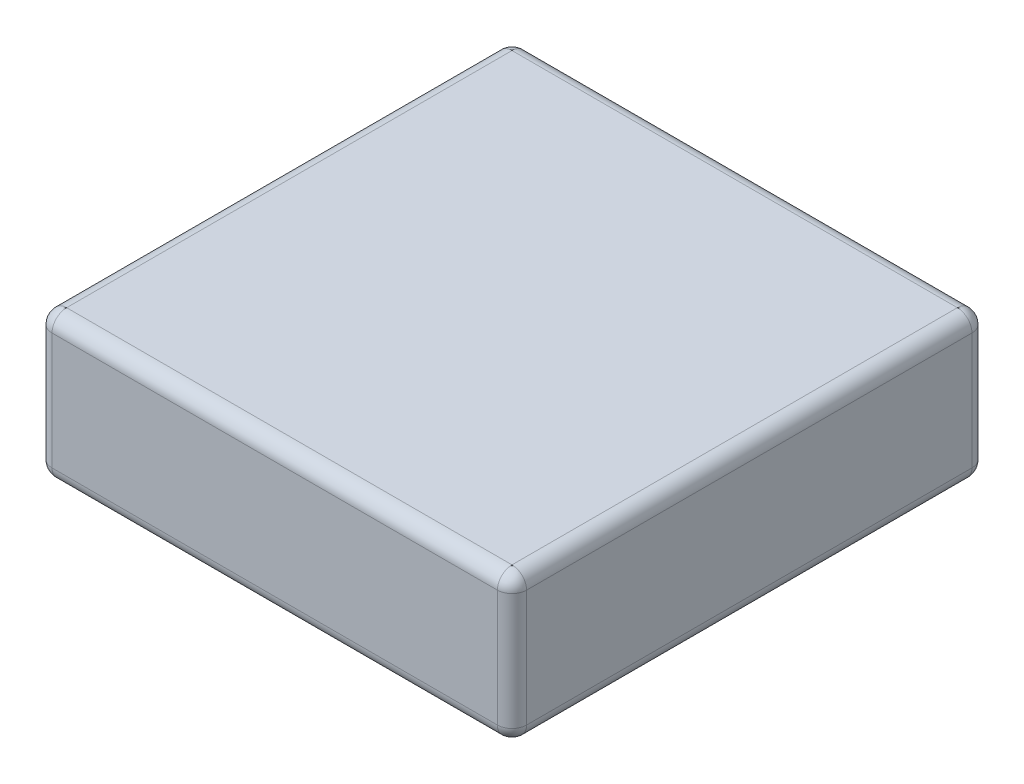
ISO-10303-21;
HEADER;
FILE_DESCRIPTION(('STEP AP214'),'2;1');
FILE_NAME('part.step','',(''),(''),'','','');
FILE_SCHEMA(('AUTOMOTIVE_DESIGN { 1 0 10303 214 1 1 1 1 }'));
ENDSEC;
DATA;
#1=APPLICATION_CONTEXT('core data for automotive mechanical design processes');
#2=APPLICATION_PROTOCOL_DEFINITION('international standard','automotive_design',2000,#1);
#3=PRODUCT_CONTEXT('',#1,'mechanical');
#4=PRODUCT('Part','Part','',(#3));
#5=PRODUCT_RELATED_PRODUCT_CATEGORY('part','',(#4));
#6=PRODUCT_DEFINITION_FORMATION('','',#4);
#7=PRODUCT_DEFINITION_CONTEXT('part definition',#1,'design');
#8=PRODUCT_DEFINITION('design','',#6,#7);
#9=PRODUCT_DEFINITION_SHAPE('','',#8);
#10=(LENGTH_UNIT() NAMED_UNIT(*) SI_UNIT(.MILLI.,.METRE.));
#11=(NAMED_UNIT(*) PLANE_ANGLE_UNIT() SI_UNIT($,.RADIAN.));
#12=(NAMED_UNIT(*) SI_UNIT($,.STERADIAN.) SOLID_ANGLE_UNIT());
#13=UNCERTAINTY_MEASURE_WITH_UNIT(LENGTH_MEASURE(1.E-05),#10,'distance_accuracy_value','');
#14=(GEOMETRIC_REPRESENTATION_CONTEXT(3) GLOBAL_UNCERTAINTY_ASSIGNED_CONTEXT((#13)) GLOBAL_UNIT_ASSIGNED_CONTEXT((#10,
#11,#12)) REPRESENTATION_CONTEXT('',''));
#15=CARTESIAN_POINT('',(0.,0.,0.));
#16=DIRECTION('',(0.,0.,1.));
#17=DIRECTION('',(1.,0.,0.));
#18=AXIS2_PLACEMENT_3D('',#15,#16,#17);
#19=CARTESIAN_POINT('',(5.82905,3.1756,-3.993025));
#20=DIRECTION('',(1.,0.,0.));
#21=DIRECTION('',(0.,0.,-1.));
#22=AXIS2_PLACEMENT_3D('',#19,#20,#21);
#23=PLANE('',#22);
#24=DIRECTION('',(0.,1.,0.));
#25=VECTOR('',#24,1.);
#26=CARTESIAN_POINT('',(5.82905,3.1756,-4.013025));
#27=LINE('',#26,#25);
#28=CARTESIAN_POINT('',(5.82905,2.9956,-4.013025));
#29=VERTEX_POINT('',#28);
#30=CARTESIAN_POINT('',(5.82905,3.1556,-4.013025));
#31=VERTEX_POINT('',#30);
#32=EDGE_CURVE('E11',#29,#31,#27,.T.);
#33=ORIENTED_EDGE('',*,*,#32,.T.);
#34=DIRECTION('',(0.,0.,-1.));
#35=VECTOR('',#34,1.);
#36=CARTESIAN_POINT('',(5.82905,3.1556,-3.993025));
#37=LINE('',#36,#35);
#38=CARTESIAN_POINT('',(5.82905,3.1556,-4.623025));
#39=VERTEX_POINT('',#38);
#40=EDGE_CURVE('E24',#31,#39,#37,.T.);
#41=ORIENTED_EDGE('',*,*,#40,.T.);
#42=DIRECTION('',(0.,-1.,0.));
#43=VECTOR('',#42,1.);
#44=CARTESIAN_POINT('',(5.82905,3.1756,-4.623025));
#45=LINE('',#44,#43);
#46=CARTESIAN_POINT('',(5.82905,2.9956,-4.623025));
#47=VERTEX_POINT('',#46);
#48=EDGE_CURVE('E215',#39,#47,#45,.T.);
#49=ORIENTED_EDGE('',*,*,#48,.T.);
#50=DIRECTION('',(0.,0.,1.));
#51=VECTOR('',#50,1.);
#52=CARTESIAN_POINT('',(5.82905,2.9956,-3.993025));
#53=LINE('',#52,#51);
#54=EDGE_CURVE('E213',#47,#29,#53,.T.);
#55=ORIENTED_EDGE('',*,*,#54,.T.);
#56=EDGE_LOOP('',(#33,#41,#49,#55));
#57=FACE_BOUND('',#56,.T.);
#58=ADVANCED_FACE('F17',(#57),#23,.F.);
#59=CARTESIAN_POINT('',(5.82905,3.1756,-3.993025));
#60=DIRECTION('',(0.,0.,-1.));
#61=DIRECTION('',(-1.,0.,0.));
#62=AXIS2_PLACEMENT_3D('',#59,#60,#61);
#63=PLANE('',#62);
#64=DIRECTION('',(-1.,0.,0.));
#65=VECTOR('',#64,1.);
#66=CARTESIAN_POINT('',(5.82905,3.1556,-3.993025));
#67=LINE('',#66,#65);
#68=CARTESIAN_POINT('',(6.45905,3.1556,-3.993025));
#69=VERTEX_POINT('',#68);
#70=CARTESIAN_POINT('',(5.84905,3.1556,-3.993025));
#71=VERTEX_POINT('',#70);
#72=EDGE_CURVE('E211',#69,#71,#67,.T.);
#73=ORIENTED_EDGE('',*,*,#72,.T.);
#74=DIRECTION('',(0.,-1.,0.));
#75=VECTOR('',#74,1.);
#76=CARTESIAN_POINT('',(5.84905,3.1756,-3.993025));
#77=LINE('',#76,#75);
#78=CARTESIAN_POINT('',(5.84905,2.9956,-3.993025));
#79=VERTEX_POINT('',#78);
#80=EDGE_CURVE('E209',#71,#79,#77,.T.);
#81=ORIENTED_EDGE('',*,*,#80,.T.);
#82=DIRECTION('',(1.,0.,0.));
#83=VECTOR('',#82,1.);
#84=CARTESIAN_POINT('',(6.47905,2.9956,-3.993025));
#85=LINE('',#84,#83);
#86=CARTESIAN_POINT('',(6.45905,2.9956,-3.993025));
#87=VERTEX_POINT('',#86);
#88=EDGE_CURVE('E135',#79,#87,#85,.T.);
#89=ORIENTED_EDGE('',*,*,#88,.T.);
#90=DIRECTION('',(0.,1.,0.));
#91=VECTOR('',#90,1.);
#92=CARTESIAN_POINT('',(6.45905,3.1756,-3.993025));
#93=LINE('',#92,#91);
#94=EDGE_CURVE('E205',#87,#69,#93,.T.);
#95=ORIENTED_EDGE('',*,*,#94,.T.);
#96=EDGE_LOOP('',(#73,#81,#89,#95));
#97=FACE_BOUND('',#96,.T.);
#98=ADVANCED_FACE('F297',(#97),#63,.F.);
#99=CARTESIAN_POINT('',(6.47905,3.1756,-3.993025));
#100=DIRECTION('',(-1.,0.,0.));
#101=DIRECTION('',(0.,0.,1.));
#102=AXIS2_PLACEMENT_3D('',#99,#100,#101);
#103=PLANE('',#102);
#104=DIRECTION('',(0.,0.,-1.));
#105=VECTOR('',#104,1.);
#106=CARTESIAN_POINT('',(6.47905,2.9956,-4.643025));
#107=LINE('',#106,#105);
#108=CARTESIAN_POINT('',(6.47905,2.9956,-4.013025));
#109=VERTEX_POINT('',#108);
#110=CARTESIAN_POINT('',(6.47905,2.9956,-4.623025));
#111=VERTEX_POINT('',#110);
#112=EDGE_CURVE('E203',#109,#111,#107,.T.);
#113=ORIENTED_EDGE('',*,*,#112,.T.);
#114=DIRECTION('',(0.,1.,0.));
#115=VECTOR('',#114,1.);
#116=CARTESIAN_POINT('',(6.47905,3.1756,-4.623025));
#117=LINE('',#116,#115);
#118=CARTESIAN_POINT('',(6.47905,3.1556,-4.623025));
#119=VERTEX_POINT('',#118);
#120=EDGE_CURVE('E201',#111,#119,#117,.T.);
#121=ORIENTED_EDGE('',*,*,#120,.T.);
#122=DIRECTION('',(0.,0.,1.));
#123=VECTOR('',#122,1.);
#124=CARTESIAN_POINT('',(6.47905,3.1556,-3.993025));
#125=LINE('',#124,#123);
#126=CARTESIAN_POINT('',(6.47905,3.1556,-4.013025));
#127=VERTEX_POINT('',#126);
#128=EDGE_CURVE('E199',#119,#127,#125,.T.);
#129=ORIENTED_EDGE('',*,*,#128,.T.);
#130=DIRECTION('',(0.,-1.,0.));
#131=VECTOR('',#130,1.);
#132=CARTESIAN_POINT('',(6.47905,3.1756,-4.013025));
#133=LINE('',#132,#131);
#134=EDGE_CURVE('E196',#127,#109,#133,.T.);
#135=ORIENTED_EDGE('',*,*,#134,.T.);
#136=EDGE_LOOP('',(#113,#121,#129,#135));
#137=FACE_BOUND('',#136,.T.);
#138=ADVANCED_FACE('F277',(#137),#103,.F.);
#139=CARTESIAN_POINT('',(5.82905,3.1756,-4.643025));
#140=DIRECTION('',(0.,0.,1.));
#141=DIRECTION('',(1.,0.,0.));
#142=AXIS2_PLACEMENT_3D('',#139,#140,#141);
#143=PLANE('',#142);
#144=DIRECTION('',(1.,0.,0.));
#145=VECTOR('',#144,1.);
#146=CARTESIAN_POINT('',(5.82905,3.1556,-4.643025));
#147=LINE('',#146,#145);
#148=CARTESIAN_POINT('',(5.84905,3.1556,-4.643025));
#149=VERTEX_POINT('',#148);
#150=CARTESIAN_POINT('',(6.45905,3.1556,-4.643025));
#151=VERTEX_POINT('',#150);
#152=EDGE_CURVE('E194',#149,#151,#147,.T.);
#153=ORIENTED_EDGE('',*,*,#152,.T.);
#154=DIRECTION('',(0.,-1.,0.));
#155=VECTOR('',#154,1.);
#156=CARTESIAN_POINT('',(6.45905,3.1756,-4.643025));
#157=LINE('',#156,#155);
#158=CARTESIAN_POINT('',(6.45905,2.9956,-4.643025));
#159=VERTEX_POINT('',#158);
#160=EDGE_CURVE('E192',#151,#159,#157,.T.);
#161=ORIENTED_EDGE('',*,*,#160,.T.);
#162=DIRECTION('',(-1.,0.,0.));
#163=VECTOR('',#162,1.);
#164=CARTESIAN_POINT('',(5.82905,2.9956,-4.643025));
#165=LINE('',#164,#163);
#166=CARTESIAN_POINT('',(5.84905,2.9956,-4.643025));
#167=VERTEX_POINT('',#166);
#168=EDGE_CURVE('E190',#159,#167,#165,.T.);
#169=ORIENTED_EDGE('',*,*,#168,.T.);
#170=DIRECTION('',(0.,1.,0.));
#171=VECTOR('',#170,1.);
#172=CARTESIAN_POINT('',(5.84905,3.1756,-4.643025));
#173=LINE('',#172,#171);
#174=EDGE_CURVE('E187',#167,#149,#173,.T.);
#175=ORIENTED_EDGE('',*,*,#174,.T.);
#176=EDGE_LOOP('',(#153,#161,#169,#175));
#177=FACE_BOUND('',#176,.T.);
#178=ADVANCED_FACE('F238',(#177),#143,.F.);
#179=CARTESIAN_POINT('',(5.22905,3.1756,-4.318025));
#180=DIRECTION('',(0.,-1.,0.));
#181=DIRECTION('',(0.,0.,-1.));
#182=AXIS2_PLACEMENT_3D('',#179,#180,#181);
#183=PLANE('',#182);
#184=DIRECTION('',(0.,0.,-1.));
#185=VECTOR('',#184,1.);
#186=CARTESIAN_POINT('',(6.45905,3.1756,-4.318025));
#187=LINE('',#186,#185);
#188=CARTESIAN_POINT('',(6.45905,3.1756,-4.013025));
#189=VERTEX_POINT('',#188);
#190=CARTESIAN_POINT('',(6.45905,3.1756,-4.623025));
#191=VERTEX_POINT('',#190);
#192=EDGE_CURVE('E185',#189,#191,#187,.T.);
#193=ORIENTED_EDGE('',*,*,#192,.T.);
#194=DIRECTION('',(-1.,0.,0.));
#195=VECTOR('',#194,1.);
#196=CARTESIAN_POINT('',(5.22905,3.1756,-4.623025));
#197=LINE('',#196,#195);
#198=CARTESIAN_POINT('',(5.84905,3.1756,-4.623025));
#199=VERTEX_POINT('',#198);
#200=EDGE_CURVE('E183',#191,#199,#197,.T.);
#201=ORIENTED_EDGE('',*,*,#200,.T.);
#202=DIRECTION('',(0.,0.,1.));
#203=VECTOR('',#202,1.);
#204=CARTESIAN_POINT('',(5.84905,3.1756,-4.318025));
#205=LINE('',#204,#203);
#206=CARTESIAN_POINT('',(5.84905,3.1756,-4.013025));
#207=VERTEX_POINT('',#206);
#208=EDGE_CURVE('E181',#199,#207,#205,.T.);
#209=ORIENTED_EDGE('',*,*,#208,.T.);
#210=DIRECTION('',(1.,0.,0.));
#211=VECTOR('',#210,1.);
#212=CARTESIAN_POINT('',(5.22905,3.1756,-4.013025));
#213=LINE('',#212,#211);
#214=EDGE_CURVE('E178',#207,#189,#213,.T.);
#215=ORIENTED_EDGE('',*,*,#214,.T.);
#216=EDGE_LOOP('',(#193,#201,#209,#215));
#217=FACE_BOUND('',#216,.T.);
#218=ADVANCED_FACE('F309',(#217),#183,.F.);
#219=CARTESIAN_POINT('',(5.22905,2.9756,-4.318025));
#220=DIRECTION('',(0.,-1.,0.));
#221=DIRECTION('',(0.,0.,-1.));
#222=AXIS2_PLACEMENT_3D('',#219,#220,#221);
#223=PLANE('',#222);
#224=DIRECTION('',(1.,0.,0.));
#225=VECTOR('',#224,1.);
#226=CARTESIAN_POINT('',(6.47905,2.9756,-4.623025));
#227=LINE('',#226,#225);
#228=CARTESIAN_POINT('',(5.84905,2.9756,-4.623025));
#229=VERTEX_POINT('',#228);
#230=CARTESIAN_POINT('',(6.45905,2.9756,-4.623025));
#231=VERTEX_POINT('',#230);
#232=EDGE_CURVE('E176',#229,#231,#227,.T.);
#233=ORIENTED_EDGE('',*,*,#232,.T.);
#234=DIRECTION('',(0.,0.,1.));
#235=VECTOR('',#234,1.);
#236=CARTESIAN_POINT('',(6.45905,2.9756,-3.993025));
#237=LINE('',#236,#235);
#238=CARTESIAN_POINT('',(6.45905,2.9756,-4.013025));
#239=VERTEX_POINT('',#238);
#240=EDGE_CURVE('E108',#231,#239,#237,.T.);
#241=ORIENTED_EDGE('',*,*,#240,.T.);
#242=DIRECTION('',(-1.,0.,0.));
#243=VECTOR('',#242,1.);
#244=CARTESIAN_POINT('',(5.82905,2.9756,-4.013025));
#245=LINE('',#244,#243);
#246=CARTESIAN_POINT('',(5.84905,2.9756,-4.013025));
#247=VERTEX_POINT('',#246);
#248=EDGE_CURVE('E102',#239,#247,#245,.T.);
#249=ORIENTED_EDGE('',*,*,#248,.T.);
#250=DIRECTION('',(0.,0.,-1.));
#251=VECTOR('',#250,1.);
#252=CARTESIAN_POINT('',(5.84905,2.9756,-4.643025));
#253=LINE('',#252,#251);
#254=EDGE_CURVE('E105',#247,#229,#253,.T.);
#255=ORIENTED_EDGE('',*,*,#254,.T.);
#256=EDGE_LOOP('',(#233,#241,#249,#255));
#257=FACE_BOUND('',#256,.T.);
#258=ADVANCED_FACE('F104',(#257),#223,.T.);
#259=CARTESIAN_POINT('',(5.84905,3.1556,-4.318025));
#260=DIRECTION('',(0.,0.,1.));
#261=DIRECTION('',(1.,0.,0.));
#262=AXIS2_PLACEMENT_3D('',#259,#260,#261);
#263=CYLINDRICAL_SURFACE('',#262,0.0200000000000001);
#264=CARTESIAN_POINT('',(5.84905,3.1556,-4.013025));
#265=DIRECTION('',(0.,0.,1.));
#266=DIRECTION('',(1.,0.,0.));
#267=AXIS2_PLACEMENT_3D('',#264,#265,#266);
#268=CIRCLE('',#267,0.0200000000000001);
#269=EDGE_CURVE('E123',#207,#31,#268,.T.);
#270=ORIENTED_EDGE('',*,*,#269,.F.);
#271=ORIENTED_EDGE('',*,*,#208,.F.);
#272=CARTESIAN_POINT('',(5.84905,3.1556,-4.623025));
#273=DIRECTION('',(0.,0.,-1.));
#274=DIRECTION('',(0.,1.,0.));
#275=AXIS2_PLACEMENT_3D('',#272,#273,#274);
#276=CIRCLE('',#275,0.0200000000000001);
#277=EDGE_CURVE('E170',#39,#199,#276,.T.);
#278=ORIENTED_EDGE('',*,*,#277,.F.);
#279=ORIENTED_EDGE('',*,*,#40,.F.);
#280=EDGE_LOOP('',(#270,#271,#278,#279));
#281=FACE_BOUND('',#280,.T.);
#282=ADVANCED_FACE('F227',(#281),#263,.T.);
#283=CARTESIAN_POINT('',(5.84905,3.1556,-4.013025));
#284=DIRECTION('',(0.,1.,0.));
#285=DIRECTION('',(1.,0.,0.));
#286=AXIS2_PLACEMENT_3D('',#283,#284,#285);
#287=SPHERICAL_SURFACE('',#286,0.02);
#288=CARTESIAN_POINT('',(5.84905,3.1556,-4.013025));
#289=DIRECTION('',(1.,0.,0.));
#290=DIRECTION('',(0.,0.,1.));
#291=AXIS2_PLACEMENT_3D('',#288,#289,#290);
#292=CIRCLE('',#291,0.0200000000000001);
#293=EDGE_CURVE('E167',#207,#71,#292,.T.);
#294=ORIENTED_EDGE('',*,*,#293,.F.);
#295=ORIENTED_EDGE('',*,*,#269,.T.);
#296=CARTESIAN_POINT('',(5.84905,3.1556,-4.013025));
#297=DIRECTION('',(0.,-1.,0.));
#298=DIRECTION('',(0.,0.,1.));
#299=AXIS2_PLACEMENT_3D('',#296,#297,#298);
#300=CIRCLE('',#299,0.0200000000000001);
#301=EDGE_CURVE('E165',#71,#31,#300,.T.);
#302=ORIENTED_EDGE('',*,*,#301,.F.);
#303=EDGE_LOOP('',(#294,#295,#302));
#304=FACE_BOUND('',#303,.T.);
#305=ADVANCED_FACE('F317',(#304),#287,.T.);
#306=CARTESIAN_POINT('',(5.84905,3.1556,-4.623025));
#307=DIRECTION('',(0.,1.,0.));
#308=DIRECTION('',(1.,0.,0.));
#309=AXIS2_PLACEMENT_3D('',#306,#307,#308);
#310=SPHERICAL_SURFACE('',#309,0.02);
#311=CARTESIAN_POINT('',(5.84905,3.1556,-4.623025));
#312=DIRECTION('',(0.,-1.,0.));
#313=DIRECTION('',(0.,0.,1.));
#314=AXIS2_PLACEMENT_3D('',#311,#312,#313);
#315=CIRCLE('',#314,0.0200000000000001);
#316=EDGE_CURVE('E162',#39,#149,#315,.T.);
#317=ORIENTED_EDGE('',*,*,#316,.F.);
#318=ORIENTED_EDGE('',*,*,#277,.T.);
#319=CARTESIAN_POINT('',(5.84905,3.1556,-4.623025));
#320=DIRECTION('',(1.,0.,0.));
#321=DIRECTION('',(0.,0.,1.));
#322=AXIS2_PLACEMENT_3D('',#319,#320,#321);
#323=CIRCLE('',#322,0.0200000000000001);
#324=EDGE_CURVE('E159',#149,#199,#323,.T.);
#325=ORIENTED_EDGE('',*,*,#324,.F.);
#326=EDGE_LOOP('',(#317,#318,#325));
#327=FACE_BOUND('',#326,.T.);
#328=ADVANCED_FACE('F229',(#327),#310,.T.);
#329=CARTESIAN_POINT('',(5.84905,3.1756,-4.013025));
#330=DIRECTION('',(0.,-1.,0.));
#331=DIRECTION('',(0.,0.,-1.));
#332=AXIS2_PLACEMENT_3D('',#329,#330,#331);
#333=CYLINDRICAL_SURFACE('',#332,0.0200000000000001);
#334=ORIENTED_EDGE('',*,*,#301,.T.);
#335=ORIENTED_EDGE('',*,*,#32,.F.);
#336=CARTESIAN_POINT('',(5.84905,2.9956,-4.013025));
#337=DIRECTION('',(0.,-1.,0.));
#338=DIRECTION('',(0.,0.,-1.));
#339=AXIS2_PLACEMENT_3D('',#336,#337,#338);
#340=CIRCLE('',#339,0.0200000000000001);
#341=EDGE_CURVE('E130',#79,#29,#340,.T.);
#342=ORIENTED_EDGE('',*,*,#341,.F.);
#343=ORIENTED_EDGE('',*,*,#80,.F.);
#344=EDGE_LOOP('',(#334,#335,#342,#343));
#345=FACE_BOUND('',#344,.T.);
#346=ADVANCED_FACE('F323',(#345),#333,.T.);
#347=CARTESIAN_POINT('',(5.22905,3.1556,-4.013025));
#348=DIRECTION('',(1.,0.,0.));
#349=DIRECTION('',(0.,0.,-1.));
#350=AXIS2_PLACEMENT_3D('',#347,#348,#349);
#351=CYLINDRICAL_SURFACE('',#350,0.0200000000000001);
#352=ORIENTED_EDGE('',*,*,#293,.T.);
#353=ORIENTED_EDGE('',*,*,#72,.F.);
#354=CARTESIAN_POINT('',(6.45905,3.1556,-4.013025));
#355=DIRECTION('',(1.,0.,0.));
#356=DIRECTION('',(0.,0.,-1.));
#357=AXIS2_PLACEMENT_3D('',#354,#355,#356);
#358=CIRCLE('',#357,0.0200000000000001);
#359=EDGE_CURVE('E155',#189,#69,#358,.T.);
#360=ORIENTED_EDGE('',*,*,#359,.F.);
#361=ORIENTED_EDGE('',*,*,#214,.F.);
#362=EDGE_LOOP('',(#352,#353,#360,#361));
#363=FACE_BOUND('',#362,.T.);
#364=ADVANCED_FACE('F326',(#363),#351,.T.);
#365=CARTESIAN_POINT('',(6.45905,3.1556,-4.318025));
#366=DIRECTION('',(0.,0.,-1.));
#367=DIRECTION('',(-1.,0.,0.));
#368=AXIS2_PLACEMENT_3D('',#365,#366,#367);
#369=CYLINDRICAL_SURFACE('',#368,0.0200000000000001);
#370=CARTESIAN_POINT('',(6.45905,3.1556,-4.623025));
#371=DIRECTION('',(0.,0.,-1.));
#372=DIRECTION('',(-1.,0.,0.));
#373=AXIS2_PLACEMENT_3D('',#370,#371,#372);
#374=CIRCLE('',#373,0.0200000000000001);
#375=EDGE_CURVE('E152',#191,#119,#374,.T.);
#376=ORIENTED_EDGE('',*,*,#375,.F.);
#377=ORIENTED_EDGE('',*,*,#192,.F.);
#378=CARTESIAN_POINT('',(6.45905,3.1556,-4.013025));
#379=DIRECTION('',(0.,0.,1.));
#380=DIRECTION('',(1.,0.,0.));
#381=AXIS2_PLACEMENT_3D('',#378,#379,#380);
#382=CIRCLE('',#381,0.0200000000000001);
#383=EDGE_CURVE('E149',#127,#189,#382,.T.);
#384=ORIENTED_EDGE('',*,*,#383,.F.);
#385=ORIENTED_EDGE('',*,*,#128,.F.);
#386=EDGE_LOOP('',(#376,#377,#384,#385));
#387=FACE_BOUND('',#386,.T.);
#388=ADVANCED_FACE('F281',(#387),#369,.T.);
#389=CARTESIAN_POINT('',(5.22905,3.1556,-4.623025));
#390=DIRECTION('',(-1.,0.,0.));
#391=DIRECTION('',(0.,0.,1.));
#392=AXIS2_PLACEMENT_3D('',#389,#390,#391);
#393=CYLINDRICAL_SURFACE('',#392,0.0200000000000001);
#394=ORIENTED_EDGE('',*,*,#324,.T.);
#395=ORIENTED_EDGE('',*,*,#200,.F.);
#396=CARTESIAN_POINT('',(6.45905,3.1556,-4.623025));
#397=DIRECTION('',(1.,0.,0.));
#398=DIRECTION('',(0.,0.,-1.));
#399=AXIS2_PLACEMENT_3D('',#396,#397,#398);
#400=CIRCLE('',#399,0.0200000000000001);
#401=EDGE_CURVE('E146',#151,#191,#400,.T.);
#402=ORIENTED_EDGE('',*,*,#401,.F.);
#403=ORIENTED_EDGE('',*,*,#152,.F.);
#404=EDGE_LOOP('',(#394,#395,#402,#403));
#405=FACE_BOUND('',#404,.T.);
#406=ADVANCED_FACE('F232',(#405),#393,.T.);
#407=CARTESIAN_POINT('',(5.84905,3.1756,-4.623025));
#408=DIRECTION('',(0.,-1.,0.));
#409=DIRECTION('',(0.,0.,-1.));
#410=AXIS2_PLACEMENT_3D('',#407,#408,#409);
#411=CYLINDRICAL_SURFACE('',#410,0.0200000000000001);
#412=ORIENTED_EDGE('',*,*,#316,.T.);
#413=ORIENTED_EDGE('',*,*,#174,.F.);
#414=CARTESIAN_POINT('',(5.84905,2.9956,-4.623025));
#415=DIRECTION('',(0.,-1.,0.));
#416=DIRECTION('',(0.,0.,-1.));
#417=AXIS2_PLACEMENT_3D('',#414,#415,#416);
#418=CIRCLE('',#417,0.0200000000000001);
#419=EDGE_CURVE('E131',#47,#167,#418,.T.);
#420=ORIENTED_EDGE('',*,*,#419,.F.);
#421=ORIENTED_EDGE('',*,*,#48,.F.);
#422=EDGE_LOOP('',(#412,#413,#420,#421));
#423=FACE_BOUND('',#422,.T.);
#424=ADVANCED_FACE('F222',(#423),#411,.T.);
#425=CARTESIAN_POINT('',(5.84905,2.9956,-3.993025));
#426=DIRECTION('',(0.,0.,-1.));
#427=DIRECTION('',(-1.,0.,0.));
#428=AXIS2_PLACEMENT_3D('',#425,#426,#427);
#429=CYLINDRICAL_SURFACE('',#428,0.0200000000000001);
#430=CARTESIAN_POINT('',(5.84905,2.9956,-4.013025));
#431=DIRECTION('',(0.,0.,1.));
#432=DIRECTION('',(1.,0.,0.));
#433=AXIS2_PLACEMENT_3D('',#430,#431,#432);
#434=CIRCLE('',#433,0.0200000000000001);
#435=EDGE_CURVE('E119',#29,#247,#434,.T.);
#436=ORIENTED_EDGE('',*,*,#435,.F.);
#437=ORIENTED_EDGE('',*,*,#54,.F.);
#438=CARTESIAN_POINT('',(5.84905,2.9956,-4.623025));
#439=DIRECTION('',(0.,0.,-1.));
#440=DIRECTION('',(-1.,0.,0.));
#441=AXIS2_PLACEMENT_3D('',#438,#439,#440);
#442=CIRCLE('',#441,0.0200000000000001);
#443=EDGE_CURVE('E121',#229,#47,#442,.T.);
#444=ORIENTED_EDGE('',*,*,#443,.F.);
#445=ORIENTED_EDGE('',*,*,#254,.F.);
#446=EDGE_LOOP('',(#436,#437,#444,#445));
#447=FACE_BOUND('',#446,.T.);
#448=ADVANCED_FACE('F117',(#447),#429,.T.);
#449=CARTESIAN_POINT('',(5.84905,2.9956,-4.013025));
#450=DIRECTION('',(0.,1.,0.));
#451=DIRECTION('',(1.,0.,0.));
#452=AXIS2_PLACEMENT_3D('',#449,#450,#451);
#453=SPHERICAL_SURFACE('',#452,0.02);
#454=ORIENTED_EDGE('',*,*,#341,.T.);
#455=ORIENTED_EDGE('',*,*,#435,.T.);
#456=CARTESIAN_POINT('',(5.84905,2.9956,-4.013025));
#457=DIRECTION('',(1.,0.,0.));
#458=DIRECTION('',(0.,0.,1.));
#459=AXIS2_PLACEMENT_3D('',#456,#457,#458);
#460=CIRCLE('',#459,0.0200000000000001);
#461=EDGE_CURVE('E129',#79,#247,#460,.T.);
#462=ORIENTED_EDGE('',*,*,#461,.F.);
#463=EDGE_LOOP('',(#454,#455,#462));
#464=FACE_BOUND('',#463,.T.);
#465=ADVANCED_FACE('F128',(#464),#453,.T.);
#466=CARTESIAN_POINT('',(6.45905,3.1556,-4.013025));
#467=DIRECTION('',(0.,1.,0.));
#468=DIRECTION('',(1.,0.,0.));
#469=AXIS2_PLACEMENT_3D('',#466,#467,#468);
#470=SPHERICAL_SURFACE('',#469,0.02);
#471=ORIENTED_EDGE('',*,*,#383,.T.);
#472=ORIENTED_EDGE('',*,*,#359,.T.);
#473=CARTESIAN_POINT('',(6.45905,3.1556,-4.013025));
#474=DIRECTION('',(0.,-1.,0.));
#475=DIRECTION('',(0.,0.,1.));
#476=AXIS2_PLACEMENT_3D('',#473,#474,#475);
#477=CIRCLE('',#476,0.0200000000000001);
#478=EDGE_CURVE('E136',#127,#69,#477,.T.);
#479=ORIENTED_EDGE('',*,*,#478,.F.);
#480=EDGE_LOOP('',(#471,#472,#479));
#481=FACE_BOUND('',#480,.T.);
#482=ADVANCED_FACE('F286',(#481),#470,.T.);
#483=CARTESIAN_POINT('',(6.45905,3.1556,-4.623025));
#484=DIRECTION('',(0.,1.,0.));
#485=DIRECTION('',(1.,0.,0.));
#486=AXIS2_PLACEMENT_3D('',#483,#484,#485);
#487=SPHERICAL_SURFACE('',#486,0.02);
#488=ORIENTED_EDGE('',*,*,#401,.T.);
#489=ORIENTED_EDGE('',*,*,#375,.T.);
#490=CARTESIAN_POINT('',(6.45905,3.1556,-4.623025));
#491=DIRECTION('',(0.,-1.,0.));
#492=DIRECTION('',(0.,0.,1.));
#493=AXIS2_PLACEMENT_3D('',#490,#491,#492);
#494=CIRCLE('',#493,0.0200000000000001);
#495=EDGE_CURVE('E140',#151,#119,#494,.T.);
#496=ORIENTED_EDGE('',*,*,#495,.F.);
#497=EDGE_LOOP('',(#488,#489,#496));
#498=FACE_BOUND('',#497,.T.);
#499=ADVANCED_FACE('F284',(#498),#487,.T.);
#500=CARTESIAN_POINT('',(5.84905,2.9956,-4.623025));
#501=DIRECTION('',(0.,1.,0.));
#502=DIRECTION('',(1.,0.,0.));
#503=AXIS2_PLACEMENT_3D('',#500,#501,#502);
#504=SPHERICAL_SURFACE('',#503,0.02);
#505=ORIENTED_EDGE('',*,*,#443,.T.);
#506=ORIENTED_EDGE('',*,*,#419,.T.);
#507=CARTESIAN_POINT('',(5.84905,2.9956,-4.623025));
#508=DIRECTION('',(1.,0.,0.));
#509=DIRECTION('',(0.,0.,1.));
#510=AXIS2_PLACEMENT_3D('',#507,#508,#509);
#511=CIRCLE('',#510,0.0200000000000001);
#512=EDGE_CURVE('E243',#229,#167,#511,.T.);
#513=ORIENTED_EDGE('',*,*,#512,.F.);
#514=EDGE_LOOP('',(#505,#506,#513));
#515=FACE_BOUND('',#514,.T.);
#516=ADVANCED_FACE('F242',(#515),#504,.T.);
#517=CARTESIAN_POINT('',(5.82905,2.9956,-4.013025));
#518=DIRECTION('',(-1.,0.,0.));
#519=DIRECTION('',(0.,0.,1.));
#520=AXIS2_PLACEMENT_3D('',#517,#518,#519);
#521=CYLINDRICAL_SURFACE('',#520,0.0200000000000001);
#522=ORIENTED_EDGE('',*,*,#461,.T.);
#523=ORIENTED_EDGE('',*,*,#248,.F.);
#524=CARTESIAN_POINT('',(6.45905,2.9956,-4.013025));
#525=DIRECTION('',(1.,0.,0.));
#526=DIRECTION('',(0.,0.,-1.));
#527=AXIS2_PLACEMENT_3D('',#524,#525,#526);
#528=CIRCLE('',#527,0.0200000000000001);
#529=EDGE_CURVE('E248',#87,#239,#528,.T.);
#530=ORIENTED_EDGE('',*,*,#529,.F.);
#531=ORIENTED_EDGE('',*,*,#88,.F.);
#532=EDGE_LOOP('',(#522,#523,#530,#531));
#533=FACE_BOUND('',#532,.T.);
#534=ADVANCED_FACE('F134',(#533),#521,.T.);
#535=CARTESIAN_POINT('',(6.45905,3.1756,-4.013025));
#536=DIRECTION('',(0.,-1.,0.));
#537=DIRECTION('',(0.,0.,-1.));
#538=AXIS2_PLACEMENT_3D('',#535,#536,#537);
#539=CYLINDRICAL_SURFACE('',#538,0.0200000000000001);
#540=ORIENTED_EDGE('',*,*,#478,.T.);
#541=ORIENTED_EDGE('',*,*,#94,.F.);
#542=CARTESIAN_POINT('',(6.45905,2.9956,-4.013025));
#543=DIRECTION('',(0.,-1.,0.));
#544=DIRECTION('',(0.,0.,-1.));
#545=AXIS2_PLACEMENT_3D('',#542,#543,#544);
#546=CIRCLE('',#545,0.0200000000000001);
#547=EDGE_CURVE('E251',#109,#87,#546,.T.);
#548=ORIENTED_EDGE('',*,*,#547,.F.);
#549=ORIENTED_EDGE('',*,*,#134,.F.);
#550=EDGE_LOOP('',(#540,#541,#548,#549));
#551=FACE_BOUND('',#550,.T.);
#552=ADVANCED_FACE('F374',(#551),#539,.T.);
#553=CARTESIAN_POINT('',(6.45905,3.1756,-4.623025));
#554=DIRECTION('',(0.,-1.,0.));
#555=DIRECTION('',(0.,0.,-1.));
#556=AXIS2_PLACEMENT_3D('',#553,#554,#555);
#557=CYLINDRICAL_SURFACE('',#556,0.0200000000000001);
#558=ORIENTED_EDGE('',*,*,#495,.T.);
#559=ORIENTED_EDGE('',*,*,#120,.F.);
#560=CARTESIAN_POINT('',(6.45905,2.9956,-4.623025));
#561=DIRECTION('',(0.,-1.,0.));
#562=DIRECTION('',(0.,0.,-1.));
#563=AXIS2_PLACEMENT_3D('',#560,#561,#562);
#564=CIRCLE('',#563,0.0200000000000001);
#565=EDGE_CURVE('E256',#159,#111,#564,.T.);
#566=ORIENTED_EDGE('',*,*,#565,.F.);
#567=ORIENTED_EDGE('',*,*,#160,.F.);
#568=EDGE_LOOP('',(#558,#559,#566,#567));
#569=FACE_BOUND('',#568,.T.);
#570=ADVANCED_FACE('F274',(#569),#557,.T.);
#571=CARTESIAN_POINT('',(5.82905,2.9956,-4.623025));
#572=DIRECTION('',(1.,0.,0.));
#573=DIRECTION('',(0.,0.,-1.));
#574=AXIS2_PLACEMENT_3D('',#571,#572,#573);
#575=CYLINDRICAL_SURFACE('',#574,0.0200000000000001);
#576=ORIENTED_EDGE('',*,*,#512,.T.);
#577=ORIENTED_EDGE('',*,*,#168,.F.);
#578=CARTESIAN_POINT('',(6.45905,2.9956,-4.623025));
#579=DIRECTION('',(1.,0.,0.));
#580=DIRECTION('',(0.,0.,-1.));
#581=AXIS2_PLACEMENT_3D('',#578,#579,#580);
#582=CIRCLE('',#581,0.0200000000000001);
#583=EDGE_CURVE('E259',#231,#159,#582,.T.);
#584=ORIENTED_EDGE('',*,*,#583,.F.);
#585=ORIENTED_EDGE('',*,*,#232,.F.);
#586=EDGE_LOOP('',(#576,#577,#584,#585));
#587=FACE_BOUND('',#586,.T.);
#588=ADVANCED_FACE('F245',(#587),#575,.T.);
#589=CARTESIAN_POINT('',(6.45905,2.9956,-4.013025));
#590=DIRECTION('',(0.,1.,0.));
#591=DIRECTION('',(1.,0.,0.));
#592=AXIS2_PLACEMENT_3D('',#589,#590,#591);
#593=SPHERICAL_SURFACE('',#592,0.02);
#594=ORIENTED_EDGE('',*,*,#547,.T.);
#595=ORIENTED_EDGE('',*,*,#529,.T.);
#596=CARTESIAN_POINT('',(6.45905,2.9956,-4.013025));
#597=DIRECTION('',(0.,0.,-1.));
#598=DIRECTION('',(1.,0.,0.));
#599=AXIS2_PLACEMENT_3D('',#596,#597,#598);
#600=CIRCLE('',#599,0.0200000000000001);
#601=EDGE_CURVE('E262',#109,#239,#600,.T.);
#602=ORIENTED_EDGE('',*,*,#601,.F.);
#603=EDGE_LOOP('',(#594,#595,#602));
#604=FACE_BOUND('',#603,.T.);
#605=ADVANCED_FACE('F400',(#604),#593,.T.);
#606=CARTESIAN_POINT('',(6.45905,2.9956,-4.623025));
#607=DIRECTION('',(0.,1.,0.));
#608=DIRECTION('',(1.,0.,0.));
#609=AXIS2_PLACEMENT_3D('',#606,#607,#608);
#610=SPHERICAL_SURFACE('',#609,0.02);
#611=ORIENTED_EDGE('',*,*,#583,.T.);
#612=ORIENTED_EDGE('',*,*,#565,.T.);
#613=CARTESIAN_POINT('',(6.45905,2.9956,-4.623025));
#614=DIRECTION('',(0.,0.,1.));
#615=DIRECTION('',(-1.,0.,0.));
#616=AXIS2_PLACEMENT_3D('',#613,#614,#615);
#617=CIRCLE('',#616,0.0200000000000001);
#618=EDGE_CURVE('E265',#231,#111,#617,.T.);
#619=ORIENTED_EDGE('',*,*,#618,.F.);
#620=EDGE_LOOP('',(#611,#612,#619));
#621=FACE_BOUND('',#620,.T.);
#622=ADVANCED_FACE('F271',(#621),#610,.T.);
#623=CARTESIAN_POINT('',(6.45905,2.9956,-3.993025));
#624=DIRECTION('',(0.,0.,1.));
#625=DIRECTION('',(1.,0.,0.));
#626=AXIS2_PLACEMENT_3D('',#623,#624,#625);
#627=CYLINDRICAL_SURFACE('',#626,0.0200000000000001);
#628=ORIENTED_EDGE('',*,*,#601,.T.);
#629=ORIENTED_EDGE('',*,*,#240,.F.);
#630=ORIENTED_EDGE('',*,*,#618,.T.);
#631=ORIENTED_EDGE('',*,*,#112,.F.);
#632=EDGE_LOOP('',(#628,#629,#630,#631));
#633=FACE_BOUND('',#632,.T.);
#634=ADVANCED_FACE('F269',(#633),#627,.T.);
#635=CLOSED_SHELL('',(#58,#98,#138,#178,#218,#258,#282,#305,#328,#346,#364,#388,#406,#424,#448,
#465,#482,#499,#516,#534,#552,#570,#588,#605,#622,#634));
#636=MANIFOLD_SOLID_BREP('B1',#635);
#637=ADVANCED_BREP_SHAPE_REPRESENTATION('',(#18,#636),#14);
#638=SHAPE_DEFINITION_REPRESENTATION(#9,#637);
ENDSEC;
END-ISO-10303-21;
